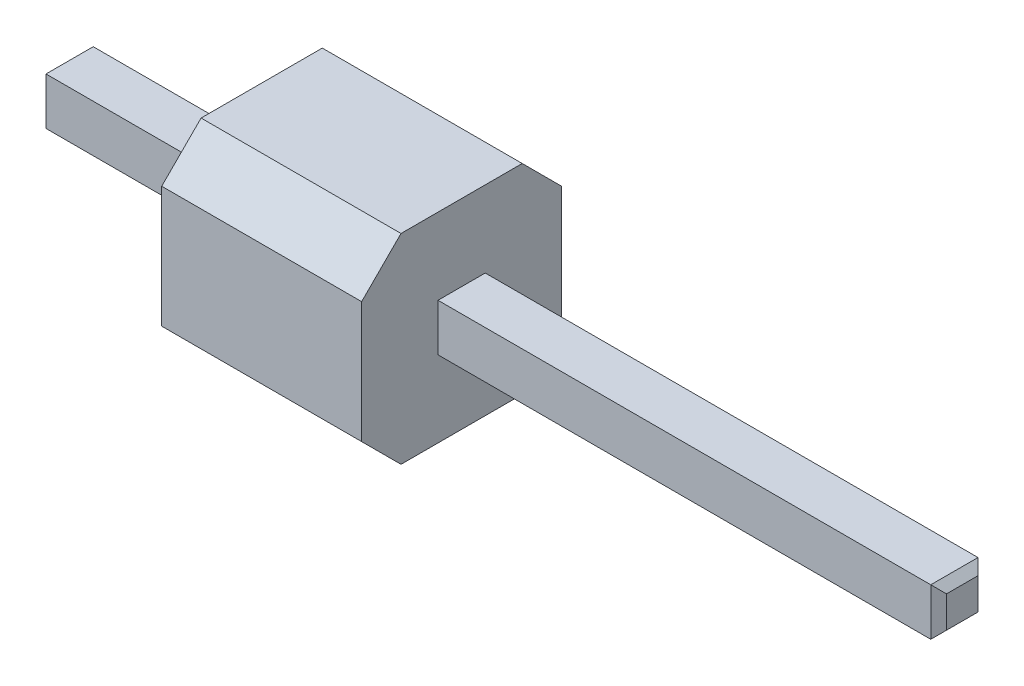
ISO-10303-21;
HEADER;
FILE_DESCRIPTION(('STEP AP214'),'2;1');
FILE_NAME('part.step','',(''),(''),'','','');
FILE_SCHEMA(('AUTOMOTIVE_DESIGN { 1 0 10303 214 1 1 1 1 }'));
ENDSEC;
DATA;
#1=APPLICATION_CONTEXT('core data for automotive mechanical design processes');
#2=APPLICATION_PROTOCOL_DEFINITION('international standard','automotive_design',2000,#1);
#3=PRODUCT_CONTEXT('',#1,'mechanical');
#4=PRODUCT('Part','Part','',(#3));
#5=PRODUCT_RELATED_PRODUCT_CATEGORY('part','',(#4));
#6=PRODUCT_DEFINITION_FORMATION('','',#4);
#7=PRODUCT_DEFINITION_CONTEXT('part definition',#1,'design');
#8=PRODUCT_DEFINITION('design','',#6,#7);
#9=PRODUCT_DEFINITION_SHAPE('','',#8);
#10=(LENGTH_UNIT() NAMED_UNIT(*) SI_UNIT(.MILLI.,.METRE.));
#11=(NAMED_UNIT(*) PLANE_ANGLE_UNIT() SI_UNIT($,.RADIAN.));
#12=(NAMED_UNIT(*) SI_UNIT($,.STERADIAN.) SOLID_ANGLE_UNIT());
#13=UNCERTAINTY_MEASURE_WITH_UNIT(LENGTH_MEASURE(1.E-05),#10,'distance_accuracy_value','');
#14=(GEOMETRIC_REPRESENTATION_CONTEXT(3) GLOBAL_UNCERTAINTY_ASSIGNED_CONTEXT((#13)) GLOBAL_UNIT_ASSIGNED_CONTEXT((#10,
#11,#12)) REPRESENTATION_CONTEXT('',''));
#15=CARTESIAN_POINT('',(0.,0.,0.));
#16=DIRECTION('',(0.,0.,1.));
#17=DIRECTION('',(1.,0.,0.));
#18=AXIS2_PLACEMENT_3D('',#15,#16,#17);
#19=CARTESIAN_POINT('',(2.54,1.27,2.04));
#20=DIRECTION('',(0.,-0.707106781186549,-0.707106781186546));
#21=DIRECTION('',(0.,0.707106781186546,-0.707106781186549));
#22=AXIS2_PLACEMENT_3D('',#19,#20,#21);
#23=PLANE('',#22);
#24=DIRECTION('',(0.,-0.707106781186546,0.707106781186549));
#25=VECTOR('',#24,1.);
#26=CARTESIAN_POINT('',(0.,1.27,2.04));
#27=LINE('',#26,#25);
#28=CARTESIAN_POINT('',(0.,1.27,2.04));
#29=VERTEX_POINT('',#28);
#30=CARTESIAN_POINT('',(0.,0.77,2.54));
#31=VERTEX_POINT('',#30);
#32=EDGE_CURVE('E298',#29,#31,#27,.T.);
#33=ORIENTED_EDGE('',*,*,#32,.T.);
#34=DIRECTION('',(-1.,0.,0.));
#35=VECTOR('',#34,1.);
#36=CARTESIAN_POINT('',(2.54,0.77,2.54));
#37=LINE('',#36,#35);
#38=CARTESIAN_POINT('',(2.54,0.77,2.54));
#39=VERTEX_POINT('',#38);
#40=EDGE_CURVE('E194',#39,#31,#37,.T.);
#41=ORIENTED_EDGE('',*,*,#40,.F.);
#42=DIRECTION('',(0.,-0.707106781186546,0.707106781186549));
#43=VECTOR('',#42,1.);
#44=CARTESIAN_POINT('',(2.54,1.27,2.04));
#45=LINE('',#44,#43);
#46=CARTESIAN_POINT('',(2.54,1.27,2.04));
#47=VERTEX_POINT('',#46);
#48=EDGE_CURVE('E299',#47,#39,#45,.T.);
#49=ORIENTED_EDGE('',*,*,#48,.F.);
#50=DIRECTION('',(-1.,0.,0.));
#51=VECTOR('',#50,1.);
#52=CARTESIAN_POINT('',(2.54,1.27,2.04));
#53=LINE('',#52,#51);
#54=EDGE_CURVE('E317',#47,#29,#53,.T.);
#55=ORIENTED_EDGE('',*,*,#54,.T.);
#56=EDGE_LOOP('',(#33,#41,#49,#55));
#57=FACE_BOUND('',#56,.T.);
#58=ADVANCED_FACE('F33',(#57),#23,.F.);
#59=CARTESIAN_POINT('',(2.54,0.77,2.54));
#60=DIRECTION('',(0.,0.,-1.));
#61=DIRECTION('',(-1.,0.,0.));
#62=AXIS2_PLACEMENT_3D('',#59,#60,#61);
#63=PLANE('',#62);
#64=DIRECTION('',(0.,-1.,0.));
#65=VECTOR('',#64,1.);
#66=CARTESIAN_POINT('',(0.,0.77,2.54));
#67=LINE('',#66,#65);
#68=CARTESIAN_POINT('',(0.,-0.77,2.54));
#69=VERTEX_POINT('',#68);
#70=EDGE_CURVE('E320',#31,#69,#67,.T.);
#71=ORIENTED_EDGE('',*,*,#70,.T.);
#72=DIRECTION('',(-1.,0.,0.));
#73=VECTOR('',#72,1.);
#74=CARTESIAN_POINT('',(2.54,-0.77,2.54));
#75=LINE('',#74,#73);
#76=CARTESIAN_POINT('',(2.54,-0.77,2.54));
#77=VERTEX_POINT('',#76);
#78=EDGE_CURVE('E350',#77,#69,#75,.T.);
#79=ORIENTED_EDGE('',*,*,#78,.F.);
#80=DIRECTION('',(0.,-1.,0.));
#81=VECTOR('',#80,1.);
#82=CARTESIAN_POINT('',(2.54,0.77,2.54));
#83=LINE('',#82,#81);
#84=EDGE_CURVE('E302',#39,#77,#83,.T.);
#85=ORIENTED_EDGE('',*,*,#84,.F.);
#86=ORIENTED_EDGE('',*,*,#40,.T.);
#87=EDGE_LOOP('',(#71,#79,#85,#86));
#88=FACE_BOUND('',#87,.T.);
#89=ADVANCED_FACE('F356',(#88),#63,.F.);
#90=CARTESIAN_POINT('',(2.54,-1.27,2.04));
#91=DIRECTION('',(0.,0.707106781186549,-0.707106781186546));
#92=DIRECTION('',(0.,0.707106781186546,0.707106781186549));
#93=AXIS2_PLACEMENT_3D('',#90,#91,#92);
#94=PLANE('',#93);
#95=DIRECTION('',(0.,-0.707106781186546,-0.707106781186549));
#96=VECTOR('',#95,1.);
#97=CARTESIAN_POINT('',(0.,-1.27,2.04));
#98=LINE('',#97,#96);
#99=CARTESIAN_POINT('',(0.,-1.27,2.04));
#100=VERTEX_POINT('',#99);
#101=EDGE_CURVE('E322',#69,#100,#98,.T.);
#102=ORIENTED_EDGE('',*,*,#101,.T.);
#103=DIRECTION('',(-1.,0.,0.));
#104=VECTOR('',#103,1.);
#105=CARTESIAN_POINT('',(2.54,-1.27,2.04));
#106=LINE('',#105,#104);
#107=CARTESIAN_POINT('',(2.54,-1.27,2.04));
#108=VERTEX_POINT('',#107);
#109=EDGE_CURVE('E347',#108,#100,#106,.T.);
#110=ORIENTED_EDGE('',*,*,#109,.F.);
#111=DIRECTION('',(0.,-0.707106781186546,-0.707106781186549));
#112=VECTOR('',#111,1.);
#113=CARTESIAN_POINT('',(2.54,-1.27,2.04));
#114=LINE('',#113,#112);
#115=EDGE_CURVE('E305',#77,#108,#114,.T.);
#116=ORIENTED_EDGE('',*,*,#115,.F.);
#117=ORIENTED_EDGE('',*,*,#78,.T.);
#118=EDGE_LOOP('',(#102,#110,#116,#117));
#119=FACE_BOUND('',#118,.T.);
#120=ADVANCED_FACE('F369',(#119),#94,.F.);
#121=CARTESIAN_POINT('',(2.54,-1.27,2.04));
#122=DIRECTION('',(0.,1.,0.));
#123=DIRECTION('',(0.,0.,1.));
#124=AXIS2_PLACEMENT_3D('',#121,#122,#123);
#125=PLANE('',#124);
#126=DIRECTION('',(0.,0.,-1.));
#127=VECTOR('',#126,1.);
#128=CARTESIAN_POINT('',(0.,-1.27,2.04));
#129=LINE('',#128,#127);
#130=CARTESIAN_POINT('',(0.,-1.27,0.500000000000002));
#131=VERTEX_POINT('',#130);
#132=EDGE_CURVE('E324',#100,#131,#129,.T.);
#133=ORIENTED_EDGE('',*,*,#132,.T.);
#134=DIRECTION('',(-1.,0.,0.));
#135=VECTOR('',#134,1.);
#136=CARTESIAN_POINT('',(2.54,-1.27,0.500000000000002));
#137=LINE('',#136,#135);
#138=CARTESIAN_POINT('',(2.54,-1.27,0.500000000000002));
#139=VERTEX_POINT('',#138);
#140=EDGE_CURVE('E344',#139,#131,#137,.T.);
#141=ORIENTED_EDGE('',*,*,#140,.F.);
#142=DIRECTION('',(0.,0.,-1.));
#143=VECTOR('',#142,1.);
#144=CARTESIAN_POINT('',(2.54,-1.27,2.04));
#145=LINE('',#144,#143);
#146=EDGE_CURVE('E307',#108,#139,#145,.T.);
#147=ORIENTED_EDGE('',*,*,#146,.F.);
#148=ORIENTED_EDGE('',*,*,#109,.T.);
#149=EDGE_LOOP('',(#133,#141,#147,#148));
#150=FACE_BOUND('',#149,.T.);
#151=ADVANCED_FACE('F373',(#150),#125,.F.);
#152=CARTESIAN_POINT('',(2.54,-1.27,0.500000000000002));
#153=DIRECTION('',(0.,0.707106781186549,0.707106781186546));
#154=DIRECTION('',(0.,-0.707106781186546,0.707106781186549));
#155=AXIS2_PLACEMENT_3D('',#152,#153,#154);
#156=PLANE('',#155);
#157=DIRECTION('',(0.,0.707106781186546,-0.707106781186549));
#158=VECTOR('',#157,1.);
#159=CARTESIAN_POINT('',(0.,-1.27,0.500000000000002));
#160=LINE('',#159,#158);
#161=CARTESIAN_POINT('',(0.,-0.77,0.));
#162=VERTEX_POINT('',#161);
#163=EDGE_CURVE('E326',#131,#162,#160,.T.);
#164=ORIENTED_EDGE('',*,*,#163,.T.);
#165=DIRECTION('',(-1.,0.,0.));
#166=VECTOR('',#165,1.);
#167=CARTESIAN_POINT('',(2.54,-0.77,0.));
#168=LINE('',#167,#166);
#169=CARTESIAN_POINT('',(2.54,-0.77,0.));
#170=VERTEX_POINT('',#169);
#171=EDGE_CURVE('E341',#170,#162,#168,.T.);
#172=ORIENTED_EDGE('',*,*,#171,.F.);
#173=DIRECTION('',(0.,0.707106781186546,-0.707106781186549));
#174=VECTOR('',#173,1.);
#175=CARTESIAN_POINT('',(2.54,-1.27,0.500000000000002));
#176=LINE('',#175,#174);
#177=EDGE_CURVE('E309',#139,#170,#176,.T.);
#178=ORIENTED_EDGE('',*,*,#177,.F.);
#179=ORIENTED_EDGE('',*,*,#140,.T.);
#180=EDGE_LOOP('',(#164,#172,#178,#179));
#181=FACE_BOUND('',#180,.T.);
#182=ADVANCED_FACE('F392',(#181),#156,.F.);
#183=CARTESIAN_POINT('',(2.54,0.77,0.));
#184=DIRECTION('',(0.,0.,1.));
#185=DIRECTION('',(1.,0.,0.));
#186=AXIS2_PLACEMENT_3D('',#183,#184,#185);
#187=PLANE('',#186);
#188=DIRECTION('',(0.,1.,0.));
#189=VECTOR('',#188,1.);
#190=CARTESIAN_POINT('',(0.,0.77,0.));
#191=LINE('',#190,#189);
#192=CARTESIAN_POINT('',(0.,0.77,0.));
#193=VERTEX_POINT('',#192);
#194=EDGE_CURVE('E328',#162,#193,#191,.T.);
#195=ORIENTED_EDGE('',*,*,#194,.T.);
#196=DIRECTION('',(-1.,0.,0.));
#197=VECTOR('',#196,1.);
#198=CARTESIAN_POINT('',(2.54,0.77,0.));
#199=LINE('',#198,#197);
#200=CARTESIAN_POINT('',(2.54,0.77,0.));
#201=VERTEX_POINT('',#200);
#202=EDGE_CURVE('E338',#201,#193,#199,.T.);
#203=ORIENTED_EDGE('',*,*,#202,.F.);
#204=DIRECTION('',(0.,1.,0.));
#205=VECTOR('',#204,1.);
#206=CARTESIAN_POINT('',(2.54,0.77,0.));
#207=LINE('',#206,#205);
#208=EDGE_CURVE('E311',#170,#201,#207,.T.);
#209=ORIENTED_EDGE('',*,*,#208,.F.);
#210=ORIENTED_EDGE('',*,*,#171,.T.);
#211=EDGE_LOOP('',(#195,#203,#209,#210));
#212=FACE_BOUND('',#211,.T.);
#213=ADVANCED_FACE('F389',(#212),#187,.F.);
#214=CARTESIAN_POINT('',(2.54,1.27,0.500000000000002));
#215=DIRECTION('',(0.,-0.707106781186549,0.707106781186546));
#216=DIRECTION('',(0.,-0.707106781186546,-0.707106781186549));
#217=AXIS2_PLACEMENT_3D('',#214,#215,#216);
#218=PLANE('',#217);
#219=DIRECTION('',(0.,0.707106781186546,0.707106781186549));
#220=VECTOR('',#219,1.);
#221=CARTESIAN_POINT('',(0.,1.27,0.500000000000002));
#222=LINE('',#221,#220);
#223=CARTESIAN_POINT('',(0.,1.27,0.500000000000002));
#224=VERTEX_POINT('',#223);
#225=EDGE_CURVE('E330',#193,#224,#222,.T.);
#226=ORIENTED_EDGE('',*,*,#225,.T.);
#227=DIRECTION('',(-1.,0.,0.));
#228=VECTOR('',#227,1.);
#229=CARTESIAN_POINT('',(2.54,1.27,0.500000000000002));
#230=LINE('',#229,#228);
#231=CARTESIAN_POINT('',(2.54,1.27,0.500000000000002));
#232=VERTEX_POINT('',#231);
#233=EDGE_CURVE('E335',#232,#224,#230,.T.);
#234=ORIENTED_EDGE('',*,*,#233,.F.);
#235=DIRECTION('',(0.,0.707106781186546,0.707106781186549));
#236=VECTOR('',#235,1.);
#237=CARTESIAN_POINT('',(2.54,1.27,0.500000000000002));
#238=LINE('',#237,#236);
#239=EDGE_CURVE('E313',#201,#232,#238,.T.);
#240=ORIENTED_EDGE('',*,*,#239,.F.);
#241=ORIENTED_EDGE('',*,*,#202,.T.);
#242=EDGE_LOOP('',(#226,#234,#240,#241));
#243=FACE_BOUND('',#242,.T.);
#244=ADVANCED_FACE('F385',(#243),#218,.F.);
#245=CARTESIAN_POINT('',(2.54,1.27,2.04));
#246=DIRECTION('',(0.,-1.,0.));
#247=DIRECTION('',(0.,0.,-1.));
#248=AXIS2_PLACEMENT_3D('',#245,#246,#247);
#249=PLANE('',#248);
#250=DIRECTION('',(0.,0.,1.));
#251=VECTOR('',#250,1.);
#252=CARTESIAN_POINT('',(0.,1.27,2.04));
#253=LINE('',#252,#251);
#254=EDGE_CURVE('E303',#224,#29,#253,.T.);
#255=ORIENTED_EDGE('',*,*,#254,.T.);
#256=ORIENTED_EDGE('',*,*,#54,.F.);
#257=DIRECTION('',(0.,0.,1.));
#258=VECTOR('',#257,1.);
#259=CARTESIAN_POINT('',(2.54,1.27,2.04));
#260=LINE('',#259,#258);
#261=EDGE_CURVE('E315',#232,#47,#260,.T.);
#262=ORIENTED_EDGE('',*,*,#261,.F.);
#263=ORIENTED_EDGE('',*,*,#233,.T.);
#264=EDGE_LOOP('',(#255,#256,#262,#263));
#265=FACE_BOUND('',#264,.T.);
#266=ADVANCED_FACE('F383',(#265),#249,.F.);
#267=CARTESIAN_POINT('',(2.54,0.,0.));
#268=DIRECTION('',(-1.,0.,0.));
#269=DIRECTION('',(0.,0.,1.));
#270=AXIS2_PLACEMENT_3D('',#267,#268,#269);
#271=PLANE('',#270);
#272=DIRECTION('',(0.,-1.,0.));
#273=VECTOR('',#272,1.);
#274=CARTESIAN_POINT('',(2.54,0.,1.57));
#275=LINE('',#274,#273);
#276=CARTESIAN_POINT('',(2.54,0.3,1.57));
#277=VERTEX_POINT('',#276);
#278=CARTESIAN_POINT('',(2.54,-0.3,1.57));
#279=VERTEX_POINT('',#278);
#280=EDGE_CURVE('E295',#277,#279,#275,.T.);
#281=ORIENTED_EDGE('',*,*,#280,.F.);
#282=DIRECTION('',(0.,0.,-1.));
#283=VECTOR('',#282,1.);
#284=CARTESIAN_POINT('',(2.54,0.3,0.));
#285=LINE('',#284,#283);
#286=CARTESIAN_POINT('',(2.54,0.3,0.97));
#287=VERTEX_POINT('',#286);
#288=EDGE_CURVE('E285',#277,#287,#285,.T.);
#289=ORIENTED_EDGE('',*,*,#288,.T.);
#290=DIRECTION('',(0.,1.,0.));
#291=VECTOR('',#290,1.);
#292=CARTESIAN_POINT('',(2.54,0.,0.97));
#293=LINE('',#292,#291);
#294=CARTESIAN_POINT('',(2.54,-0.3,0.97));
#295=VERTEX_POINT('',#294);
#296=EDGE_CURVE('E280',#295,#287,#293,.T.);
#297=ORIENTED_EDGE('',*,*,#296,.F.);
#298=DIRECTION('',(0.,0.,-1.));
#299=VECTOR('',#298,1.);
#300=CARTESIAN_POINT('',(2.54,-0.3,0.));
#301=LINE('',#300,#299);
#302=EDGE_CURVE('E281',#279,#295,#301,.T.);
#303=ORIENTED_EDGE('',*,*,#302,.F.);
#304=EDGE_LOOP('',(#281,#289,#297,#303));
#305=FACE_BOUND('',#304,.T.);
#306=ORIENTED_EDGE('',*,*,#48,.T.);
#307=ORIENTED_EDGE('',*,*,#84,.T.);
#308=ORIENTED_EDGE('',*,*,#115,.T.);
#309=ORIENTED_EDGE('',*,*,#146,.T.);
#310=ORIENTED_EDGE('',*,*,#177,.T.);
#311=ORIENTED_EDGE('',*,*,#208,.T.);
#312=ORIENTED_EDGE('',*,*,#239,.T.);
#313=ORIENTED_EDGE('',*,*,#261,.T.);
#314=EDGE_LOOP('',(#306,#307,#308,#309,#310,#311,#312,#313));
#315=FACE_BOUND('',#314,.T.);
#316=ADVANCED_FACE('F377',(#305,#315),#271,.F.);
#317=CARTESIAN_POINT('',(0.,0.,0.));
#318=DIRECTION('',(-1.,0.,0.));
#319=DIRECTION('',(0.,0.,1.));
#320=AXIS2_PLACEMENT_3D('',#317,#318,#319);
#321=PLANE('',#320);
#322=DIRECTION('',(0.,0.,-1.));
#323=VECTOR('',#322,1.);
#324=CARTESIAN_POINT('',(0.,0.3,0.));
#325=LINE('',#324,#323);
#326=CARTESIAN_POINT('',(0.,0.3,1.57));
#327=VERTEX_POINT('',#326);
#328=CARTESIAN_POINT('',(0.,0.3,0.97));
#329=VERTEX_POINT('',#328);
#330=EDGE_CURVE('E198',#327,#329,#325,.T.);
#331=ORIENTED_EDGE('',*,*,#330,.F.);
#332=DIRECTION('',(0.,-1.,0.));
#333=VECTOR('',#332,1.);
#334=CARTESIAN_POINT('',(0.,0.,1.57));
#335=LINE('',#334,#333);
#336=CARTESIAN_POINT('',(0.,-0.3,1.57));
#337=VERTEX_POINT('',#336);
#338=EDGE_CURVE('E176',#327,#337,#335,.T.);
#339=ORIENTED_EDGE('',*,*,#338,.T.);
#340=DIRECTION('',(0.,0.,-1.));
#341=VECTOR('',#340,1.);
#342=CARTESIAN_POINT('',(0.,-0.3,0.));
#343=LINE('',#342,#341);
#344=CARTESIAN_POINT('',(0.,-0.3,0.97));
#345=VERTEX_POINT('',#344);
#346=EDGE_CURVE('E187',#337,#345,#343,.T.);
#347=ORIENTED_EDGE('',*,*,#346,.T.);
#348=DIRECTION('',(0.,1.,0.));
#349=VECTOR('',#348,1.);
#350=CARTESIAN_POINT('',(0.,0.,0.97));
#351=LINE('',#350,#349);
#352=EDGE_CURVE('E193',#345,#329,#351,.T.);
#353=ORIENTED_EDGE('',*,*,#352,.T.);
#354=EDGE_LOOP('',(#331,#339,#347,#353));
#355=FACE_BOUND('',#354,.T.);
#356=ORIENTED_EDGE('',*,*,#32,.F.);
#357=ORIENTED_EDGE('',*,*,#254,.F.);
#358=ORIENTED_EDGE('',*,*,#225,.F.);
#359=ORIENTED_EDGE('',*,*,#194,.F.);
#360=ORIENTED_EDGE('',*,*,#163,.F.);
#361=ORIENTED_EDGE('',*,*,#132,.F.);
#362=ORIENTED_EDGE('',*,*,#101,.F.);
#363=ORIENTED_EDGE('',*,*,#70,.F.);
#364=EDGE_LOOP('',(#356,#357,#358,#359,#360,#361,#362,#363));
#365=FACE_BOUND('',#364,.T.);
#366=ADVANCED_FACE('F196',(#355,#365),#321,.T.);
#367=CARTESIAN_POINT('',(-2.54,0.3,0.97));
#368=DIRECTION('',(1.,0.,0.));
#369=DIRECTION('',(0.,0.,-1.));
#370=AXIS2_PLACEMENT_3D('',#367,#368,#369);
#371=PLANE('',#370);
#372=DIRECTION('',(0.,-1.,0.));
#373=VECTOR('',#372,1.);
#374=CARTESIAN_POINT('',(-2.54,0.3,1.07));
#375=LINE('',#374,#373);
#376=CARTESIAN_POINT('',(-2.54,0.199999999999997,1.07));
#377=VERTEX_POINT('',#376);
#378=CARTESIAN_POINT('',(-2.54,-0.199999999999997,1.07));
#379=VERTEX_POINT('',#378);
#380=EDGE_CURVE('E207',#377,#379,#375,.T.);
#381=ORIENTED_EDGE('',*,*,#380,.T.);
#382=DIRECTION('',(0.,0.,1.));
#383=VECTOR('',#382,1.);
#384=CARTESIAN_POINT('',(-2.54,-0.199999999999997,0.97));
#385=LINE('',#384,#383);
#386=CARTESIAN_POINT('',(-2.54,-0.199999999999997,1.47));
#387=VERTEX_POINT('',#386);
#388=EDGE_CURVE('E209',#379,#387,#385,.T.);
#389=ORIENTED_EDGE('',*,*,#388,.T.);
#390=DIRECTION('',(0.,1.,0.));
#391=VECTOR('',#390,1.);
#392=CARTESIAN_POINT('',(-2.54,0.3,1.47));
#393=LINE('',#392,#391);
#394=CARTESIAN_POINT('',(-2.54,0.199999999999997,1.47));
#395=VERTEX_POINT('',#394);
#396=EDGE_CURVE('E200',#387,#395,#393,.T.);
#397=ORIENTED_EDGE('',*,*,#396,.T.);
#398=DIRECTION('',(0.,0.,-1.));
#399=VECTOR('',#398,1.);
#400=CARTESIAN_POINT('',(-2.54,0.199999999999997,0.97));
#401=LINE('',#400,#399);
#402=EDGE_CURVE('E205',#395,#377,#401,.T.);
#403=ORIENTED_EDGE('',*,*,#402,.T.);
#404=EDGE_LOOP('',(#381,#389,#397,#403));
#405=FACE_BOUND('',#404,.T.);
#406=ADVANCED_FACE('F507',(#405),#371,.F.);
#407=CARTESIAN_POINT('',(0.,0.3,0.));
#408=DIRECTION('',(0.,1.,0.));
#409=DIRECTION('',(0.,0.,1.));
#410=AXIS2_PLACEMENT_3D('',#407,#408,#409);
#411=PLANE('',#410);
#412=DIRECTION('',(-1.,0.,0.));
#413=VECTOR('',#412,1.);
#414=CARTESIAN_POINT('',(-2.54,0.3,0.97));
#415=LINE('',#414,#413);
#416=CARTESIAN_POINT('',(-2.44,0.3,0.97));
#417=VERTEX_POINT('',#416);
#418=EDGE_CURVE('E282',#329,#417,#415,.T.);
#419=ORIENTED_EDGE('',*,*,#418,.T.);
#420=DIRECTION('',(0.,0.,1.));
#421=VECTOR('',#420,1.);
#422=CARTESIAN_POINT('',(-2.44,0.3,1.57));
#423=LINE('',#422,#421);
#424=CARTESIAN_POINT('',(-2.44,0.3,1.57));
#425=VERTEX_POINT('',#424);
#426=EDGE_CURVE('E216',#417,#425,#423,.T.);
#427=ORIENTED_EDGE('',*,*,#426,.T.);
#428=DIRECTION('',(1.,0.,0.));
#429=VECTOR('',#428,1.);
#430=CARTESIAN_POINT('',(-2.54,0.3,1.57));
#431=LINE('',#430,#429);
#432=EDGE_CURVE('E288',#425,#327,#431,.T.);
#433=ORIENTED_EDGE('',*,*,#432,.T.);
#434=ORIENTED_EDGE('',*,*,#330,.T.);
#435=EDGE_LOOP('',(#419,#427,#433,#434));
#436=FACE_BOUND('',#435,.T.);
#437=ADVANCED_FACE('F470',(#436),#411,.T.);
#438=CARTESIAN_POINT('',(0.,-0.3,0.));
#439=DIRECTION('',(0.,1.,0.));
#440=DIRECTION('',(0.,0.,1.));
#441=AXIS2_PLACEMENT_3D('',#438,#439,#440);
#442=PLANE('',#441);
#443=DIRECTION('',(1.,0.,0.));
#444=VECTOR('',#443,1.);
#445=CARTESIAN_POINT('',(-2.54,-0.3,1.57));
#446=LINE('',#445,#444);
#447=CARTESIAN_POINT('',(-2.44,-0.3,1.57));
#448=VERTEX_POINT('',#447);
#449=EDGE_CURVE('E171',#448,#337,#446,.T.);
#450=ORIENTED_EDGE('',*,*,#449,.F.);
#451=DIRECTION('',(0.,0.,-1.));
#452=VECTOR('',#451,1.);
#453=CARTESIAN_POINT('',(-2.44,-0.3,0.));
#454=LINE('',#453,#452);
#455=CARTESIAN_POINT('',(-2.44,-0.3,0.97));
#456=VERTEX_POINT('',#455);
#457=EDGE_CURVE('E212',#448,#456,#454,.T.);
#458=ORIENTED_EDGE('',*,*,#457,.T.);
#459=DIRECTION('',(-1.,0.,0.));
#460=VECTOR('',#459,1.);
#461=CARTESIAN_POINT('',(-2.54,-0.3,0.97));
#462=LINE('',#461,#460);
#463=EDGE_CURVE('E183',#345,#456,#462,.T.);
#464=ORIENTED_EDGE('',*,*,#463,.F.);
#465=ORIENTED_EDGE('',*,*,#346,.F.);
#466=EDGE_LOOP('',(#450,#458,#464,#465));
#467=FACE_BOUND('',#466,.T.);
#468=ADVANCED_FACE('F188',(#467),#442,.F.);
#469=CARTESIAN_POINT('',(-2.54,0.3,0.97));
#470=DIRECTION('',(0.,0.,1.));
#471=DIRECTION('',(1.,0.,0.));
#472=AXIS2_PLACEMENT_3D('',#469,#470,#471);
#473=PLANE('',#472);
#474=ORIENTED_EDGE('',*,*,#463,.T.);
#475=DIRECTION('',(0.,1.,0.));
#476=VECTOR('',#475,1.);
#477=CARTESIAN_POINT('',(-2.44,0.3,0.97));
#478=LINE('',#477,#476);
#479=EDGE_CURVE('E214',#456,#417,#478,.T.);
#480=ORIENTED_EDGE('',*,*,#479,.T.);
#481=ORIENTED_EDGE('',*,*,#418,.F.);
#482=ORIENTED_EDGE('',*,*,#352,.F.);
#483=EDGE_LOOP('',(#474,#480,#481,#482));
#484=FACE_BOUND('',#483,.T.);
#485=ADVANCED_FACE('F478',(#484),#473,.F.);
#486=CARTESIAN_POINT('',(-2.54,0.3,1.57));
#487=DIRECTION('',(0.,0.,-1.));
#488=DIRECTION('',(-1.,0.,0.));
#489=AXIS2_PLACEMENT_3D('',#486,#487,#488);
#490=PLANE('',#489);
#491=ORIENTED_EDGE('',*,*,#432,.F.);
#492=DIRECTION('',(0.,-1.,0.));
#493=VECTOR('',#492,1.);
#494=CARTESIAN_POINT('',(-2.44,0.3,1.57));
#495=LINE('',#494,#493);
#496=EDGE_CURVE('E179',#425,#448,#495,.T.);
#497=ORIENTED_EDGE('',*,*,#496,.T.);
#498=ORIENTED_EDGE('',*,*,#449,.T.);
#499=ORIENTED_EDGE('',*,*,#338,.F.);
#500=EDGE_LOOP('',(#491,#497,#498,#499));
#501=FACE_BOUND('',#500,.T.);
#502=ADVANCED_FACE('F174',(#501),#490,.F.);
#503=CARTESIAN_POINT('',(8.8,-0.3,1.57));
#504=VERTEX_POINT('',#503);
#505=EDGE_CURVE('E184',#279,#504,#446,.T.);
#506=ORIENTED_EDGE('',*,*,#505,.T.);
#507=DIRECTION('',(0.,1.,0.));
#508=VECTOR('',#507,1.);
#509=CARTESIAN_POINT('',(8.8,0.3,1.57));
#510=LINE('',#509,#508);
#511=CARTESIAN_POINT('',(8.8,0.3,1.57));
#512=VERTEX_POINT('',#511);
#513=EDGE_CURVE('E231',#504,#512,#510,.T.);
#514=ORIENTED_EDGE('',*,*,#513,.T.);
#515=EDGE_CURVE('E276',#277,#512,#431,.T.);
#516=ORIENTED_EDGE('',*,*,#515,.F.);
#517=ORIENTED_EDGE('',*,*,#280,.T.);
#518=EDGE_LOOP('',(#506,#514,#516,#517));
#519=FACE_BOUND('',#518,.T.);
#520=ADVANCED_FACE('F476',(#519),#490,.F.);
#521=CARTESIAN_POINT('',(8.8,0.3,0.97));
#522=VERTEX_POINT('',#521);
#523=EDGE_CURVE('E273',#522,#287,#415,.T.);
#524=ORIENTED_EDGE('',*,*,#523,.F.);
#525=DIRECTION('',(0.,-1.,0.));
#526=VECTOR('',#525,1.);
#527=CARTESIAN_POINT('',(8.8,0.3,0.97));
#528=LINE('',#527,#526);
#529=CARTESIAN_POINT('',(8.8,-0.3,0.97));
#530=VERTEX_POINT('',#529);
#531=EDGE_CURVE('E11',#522,#530,#528,.T.);
#532=ORIENTED_EDGE('',*,*,#531,.T.);
#533=EDGE_CURVE('E291',#530,#295,#462,.T.);
#534=ORIENTED_EDGE('',*,*,#533,.T.);
#535=ORIENTED_EDGE('',*,*,#296,.T.);
#536=EDGE_LOOP('',(#524,#532,#534,#535));
#537=FACE_BOUND('',#536,.T.);
#538=ADVANCED_FACE('F278',(#537),#473,.F.);
#539=ORIENTED_EDGE('',*,*,#515,.T.);
#540=DIRECTION('',(0.,0.,-1.));
#541=VECTOR('',#540,1.);
#542=CARTESIAN_POINT('',(8.8,0.3,0.97));
#543=LINE('',#542,#541);
#544=EDGE_CURVE('E219',#512,#522,#543,.T.);
#545=ORIENTED_EDGE('',*,*,#544,.T.);
#546=ORIENTED_EDGE('',*,*,#523,.T.);
#547=ORIENTED_EDGE('',*,*,#288,.F.);
#548=EDGE_LOOP('',(#539,#545,#546,#547));
#549=FACE_BOUND('',#548,.T.);
#550=ADVANCED_FACE('F271',(#549),#411,.T.);
#551=ORIENTED_EDGE('',*,*,#533,.F.);
#552=DIRECTION('',(0.,0.,1.));
#553=VECTOR('',#552,1.);
#554=CARTESIAN_POINT('',(8.8,-0.3,0.));
#555=LINE('',#554,#553);
#556=EDGE_CURVE('E42',#530,#504,#555,.T.);
#557=ORIENTED_EDGE('',*,*,#556,.T.);
#558=ORIENTED_EDGE('',*,*,#505,.F.);
#559=ORIENTED_EDGE('',*,*,#302,.T.);
#560=EDGE_LOOP('',(#551,#557,#558,#559));
#561=FACE_BOUND('',#560,.T.);
#562=ADVANCED_FACE('F456',(#561),#442,.F.);
#563=CARTESIAN_POINT('',(8.9,0.3,1.57));
#564=DIRECTION('',(-1.,0.,0.));
#565=DIRECTION('',(0.,0.,1.));
#566=AXIS2_PLACEMENT_3D('',#563,#564,#565);
#567=PLANE('',#566);
#568=DIRECTION('',(0.,1.,0.));
#569=VECTOR('',#568,1.);
#570=CARTESIAN_POINT('',(8.9,0.3,1.07));
#571=LINE('',#570,#569);
#572=CARTESIAN_POINT('',(8.9,-0.200000000000001,1.07));
#573=VERTEX_POINT('',#572);
#574=CARTESIAN_POINT('',(8.9,0.200000000000001,1.07));
#575=VERTEX_POINT('',#574);
#576=EDGE_CURVE('E222',#573,#575,#571,.T.);
#577=ORIENTED_EDGE('',*,*,#576,.T.);
#578=DIRECTION('',(0.,0.,1.));
#579=VECTOR('',#578,1.);
#580=CARTESIAN_POINT('',(8.9,0.200000000000001,1.57));
#581=LINE('',#580,#579);
#582=CARTESIAN_POINT('',(8.9,0.200000000000001,1.47));
#583=VERTEX_POINT('',#582);
#584=EDGE_CURVE('E228',#575,#583,#581,.T.);
#585=ORIENTED_EDGE('',*,*,#584,.T.);
#586=DIRECTION('',(0.,-1.,0.));
#587=VECTOR('',#586,1.);
#588=CARTESIAN_POINT('',(8.9,0.3,1.47));
#589=LINE('',#588,#587);
#590=CARTESIAN_POINT('',(8.9,-0.200000000000001,1.47));
#591=VERTEX_POINT('',#590);
#592=EDGE_CURVE('E226',#583,#591,#589,.T.);
#593=ORIENTED_EDGE('',*,*,#592,.T.);
#594=DIRECTION('',(0.,0.,-1.));
#595=VECTOR('',#594,1.);
#596=CARTESIAN_POINT('',(8.9,-0.200000000000001,1.57));
#597=LINE('',#596,#595);
#598=EDGE_CURVE('E224',#591,#573,#597,.T.);
#599=ORIENTED_EDGE('',*,*,#598,.T.);
#600=EDGE_LOOP('',(#577,#585,#593,#599));
#601=FACE_BOUND('',#600,.T.);
#602=ADVANCED_FACE('F262',(#601),#567,.F.);
#603=CARTESIAN_POINT('',(-2.44,0.3,0.));
#604=DIRECTION('',(-0.707106781186554,0.707106781186541,0.));
#605=DIRECTION('',(0.,0.,-1.));
#606=AXIS2_PLACEMENT_3D('',#603,#604,#605);
#607=PLANE('',#606);
#608=DIRECTION('',(0.577350269189619,0.577350269189629,0.577350269189629));
#609=VECTOR('',#608,1.);
#610=CARTESIAN_POINT('',(-2.44,0.3,1.57));
#611=LINE('',#610,#609);
#612=EDGE_CURVE('E238',#425,#395,#611,.F.);
#613=ORIENTED_EDGE('',*,*,#612,.F.);
#614=ORIENTED_EDGE('',*,*,#426,.F.);
#615=DIRECTION('',(0.577350269189619,0.577350269189629,-0.577350269189629));
#616=VECTOR('',#615,1.);
#617=CARTESIAN_POINT('',(-2.11666666666667,0.623333333333337,0.646666666666663));
#618=LINE('',#617,#616);
#619=EDGE_CURVE('E241',#377,#417,#618,.T.);
#620=ORIENTED_EDGE('',*,*,#619,.F.);
#621=ORIENTED_EDGE('',*,*,#402,.F.);
#622=EDGE_LOOP('',(#613,#614,#620,#621));
#623=FACE_BOUND('',#622,.T.);
#624=ADVANCED_FACE('F420',(#623),#607,.T.);
#625=CARTESIAN_POINT('',(-2.54,0.3,1.07));
#626=DIRECTION('',(0.707106781186554,0.,0.707106781186541));
#627=DIRECTION('',(0.,-1.,0.));
#628=AXIS2_PLACEMENT_3D('',#625,#626,#627);
#629=PLANE('',#628);
#630=ORIENTED_EDGE('',*,*,#619,.T.);
#631=ORIENTED_EDGE('',*,*,#479,.F.);
#632=DIRECTION('',(-0.577350269189619,0.577350269189629,0.577350269189629));
#633=VECTOR('',#632,1.);
#634=CARTESIAN_POINT('',(-2.70666666666666,-0.0333333333333294,1.23666666666667));
#635=LINE('',#634,#633);
#636=EDGE_CURVE('E236',#379,#456,#635,.F.);
#637=ORIENTED_EDGE('',*,*,#636,.F.);
#638=ORIENTED_EDGE('',*,*,#380,.F.);
#639=EDGE_LOOP('',(#630,#631,#637,#638));
#640=FACE_BOUND('',#639,.T.);
#641=ADVANCED_FACE('F416',(#640),#629,.F.);
#642=CARTESIAN_POINT('',(-2.44,0.3,1.57));
#643=DIRECTION('',(0.707106781186554,0.,-0.707106781186541));
#644=DIRECTION('',(0.,-1.,0.));
#645=AXIS2_PLACEMENT_3D('',#642,#643,#644);
#646=PLANE('',#645);
#647=ORIENTED_EDGE('',*,*,#612,.T.);
#648=ORIENTED_EDGE('',*,*,#396,.F.);
#649=DIRECTION('',(0.577350269189619,-0.577350269189629,0.577350269189629));
#650=VECTOR('',#649,1.);
#651=CARTESIAN_POINT('',(-2.64,-0.0999999999999976,1.37));
#652=LINE('',#651,#650);
#653=EDGE_CURVE('E234',#448,#387,#652,.F.);
#654=ORIENTED_EDGE('',*,*,#653,.F.);
#655=ORIENTED_EDGE('',*,*,#496,.F.);
#656=EDGE_LOOP('',(#647,#648,#654,#655));
#657=FACE_BOUND('',#656,.T.);
#658=ADVANCED_FACE('F412',(#657),#646,.F.);
#659=CARTESIAN_POINT('',(-2.54,-0.199999999999997,0.97));
#660=DIRECTION('',(0.707106781186554,0.707106781186541,0.));
#661=DIRECTION('',(0.,0.,1.));
#662=AXIS2_PLACEMENT_3D('',#659,#660,#661);
#663=PLANE('',#662);
#664=ORIENTED_EDGE('',*,*,#636,.T.);
#665=ORIENTED_EDGE('',*,*,#457,.F.);
#666=ORIENTED_EDGE('',*,*,#653,.T.);
#667=ORIENTED_EDGE('',*,*,#388,.F.);
#668=EDGE_LOOP('',(#664,#665,#666,#667));
#669=FACE_BOUND('',#668,.T.);
#670=ADVANCED_FACE('F409',(#669),#663,.F.);
#671=CARTESIAN_POINT('',(8.9,-0.200000000000001,1.57));
#672=DIRECTION('',(-0.707106781186548,0.707106781186548,0.));
#673=DIRECTION('',(0.,0.,-1.));
#674=AXIS2_PLACEMENT_3D('',#671,#672,#673);
#675=PLANE('',#674);
#676=DIRECTION('',(-0.577350269189626,-0.577350269189626,-0.577350269189626));
#677=VECTOR('',#676,1.);
#678=CARTESIAN_POINT('',(9.,-0.1,1.17));
#679=LINE('',#678,#677);
#680=EDGE_CURVE('E247',#573,#530,#679,.T.);
#681=ORIENTED_EDGE('',*,*,#680,.F.);
#682=ORIENTED_EDGE('',*,*,#598,.F.);
#683=DIRECTION('',(-0.577350269189626,-0.577350269189626,0.577350269189626));
#684=VECTOR('',#683,1.);
#685=CARTESIAN_POINT('',(8.86666666666667,-0.233333333333334,1.50333333333333));
#686=LINE('',#685,#684);
#687=EDGE_CURVE('E37',#504,#591,#686,.F.);
#688=ORIENTED_EDGE('',*,*,#687,.F.);
#689=ORIENTED_EDGE('',*,*,#556,.F.);
#690=EDGE_LOOP('',(#681,#682,#688,#689));
#691=FACE_BOUND('',#690,.T.);
#692=ADVANCED_FACE('F35',(#691),#675,.F.);
#693=CARTESIAN_POINT('',(8.9,0.3,1.47));
#694=DIRECTION('',(-0.707106781186548,0.,-0.707106781186548));
#695=DIRECTION('',(0.,-1.,0.));
#696=AXIS2_PLACEMENT_3D('',#693,#694,#695);
#697=PLANE('',#696);
#698=ORIENTED_EDGE('',*,*,#687,.T.);
#699=ORIENTED_EDGE('',*,*,#592,.F.);
#700=DIRECTION('',(0.577350269189626,-0.577350269189626,-0.577350269189626));
#701=VECTOR('',#700,1.);
#702=CARTESIAN_POINT('',(8.86666666666667,0.233333333333334,1.50333333333333));
#703=LINE('',#702,#701);
#704=EDGE_CURVE('E246',#512,#583,#703,.T.);
#705=ORIENTED_EDGE('',*,*,#704,.F.);
#706=ORIENTED_EDGE('',*,*,#513,.F.);
#707=EDGE_LOOP('',(#698,#699,#705,#706));
#708=FACE_BOUND('',#707,.T.);
#709=ADVANCED_FACE('F257',(#708),#697,.F.);
#710=CARTESIAN_POINT('',(8.8,0.3,0.97));
#711=DIRECTION('',(-0.707106781186548,0.,0.707106781186548));
#712=DIRECTION('',(0.,-1.,0.));
#713=AXIS2_PLACEMENT_3D('',#710,#711,#712);
#714=PLANE('',#713);
#715=ORIENTED_EDGE('',*,*,#680,.T.);
#716=ORIENTED_EDGE('',*,*,#531,.F.);
#717=DIRECTION('',(-0.577350269189626,0.577350269189626,-0.577350269189626));
#718=VECTOR('',#717,1.);
#719=CARTESIAN_POINT('',(8.8,0.3,0.97));
#720=LINE('',#719,#718);
#721=EDGE_CURVE('E244',#575,#522,#720,.T.);
#722=ORIENTED_EDGE('',*,*,#721,.F.);
#723=ORIENTED_EDGE('',*,*,#576,.F.);
#724=EDGE_LOOP('',(#715,#716,#722,#723));
#725=FACE_BOUND('',#724,.T.);
#726=ADVANCED_FACE('F268',(#725),#714,.F.);
#727=CARTESIAN_POINT('',(8.8,0.3,0.));
#728=DIRECTION('',(0.707106781186548,0.707106781186548,0.));
#729=DIRECTION('',(0.,0.,1.));
#730=AXIS2_PLACEMENT_3D('',#727,#728,#729);
#731=PLANE('',#730);
#732=ORIENTED_EDGE('',*,*,#704,.T.);
#733=ORIENTED_EDGE('',*,*,#584,.F.);
#734=ORIENTED_EDGE('',*,*,#721,.T.);
#735=ORIENTED_EDGE('',*,*,#544,.F.);
#736=EDGE_LOOP('',(#732,#733,#734,#735));
#737=FACE_BOUND('',#736,.T.);
#738=ADVANCED_FACE('F266',(#737),#731,.T.);
#739=CLOSED_SHELL('',(#58,#89,#120,#151,#182,#213,#244,#266,#316,#366,#406,#437,#468,#485,#502,
#520,#538,#550,#562,#602,#624,#641,#658,#670,#692,#709,#726,#738));
#740=MANIFOLD_SOLID_BREP('B2',#739);
#741=ADVANCED_BREP_SHAPE_REPRESENTATION('',(#18,#740),#14);
#742=SHAPE_DEFINITION_REPRESENTATION(#9,#741);
ENDSEC;
END-ISO-10303-21;
